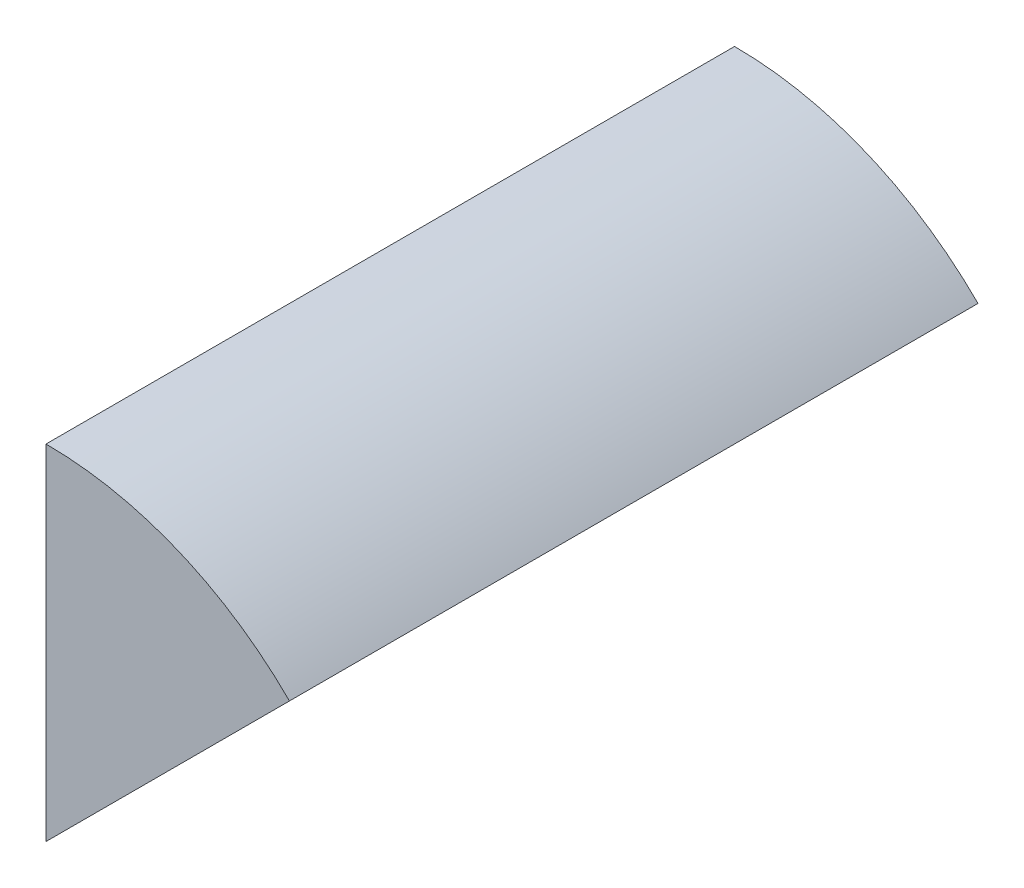
ISO-10303-21;
HEADER;
FILE_DESCRIPTION(('STEP AP214'),'2;1');
FILE_NAME('part.step','',(''),(''),'','','');
FILE_SCHEMA(('AUTOMOTIVE_DESIGN { 1 0 10303 214 1 1 1 1 }'));
ENDSEC;
DATA;
#1=APPLICATION_CONTEXT('core data for automotive mechanical design processes');
#2=APPLICATION_PROTOCOL_DEFINITION('international standard','automotive_design',2000,#1);
#3=PRODUCT_CONTEXT('',#1,'mechanical');
#4=PRODUCT('Part','Part','',(#3));
#5=PRODUCT_RELATED_PRODUCT_CATEGORY('part','',(#4));
#6=PRODUCT_DEFINITION_FORMATION('','',#4);
#7=PRODUCT_DEFINITION_CONTEXT('part definition',#1,'design');
#8=PRODUCT_DEFINITION('design','',#6,#7);
#9=PRODUCT_DEFINITION_SHAPE('','',#8);
#10=(LENGTH_UNIT() NAMED_UNIT(*) SI_UNIT(.MILLI.,.METRE.));
#11=(NAMED_UNIT(*) PLANE_ANGLE_UNIT() SI_UNIT($,.RADIAN.));
#12=(NAMED_UNIT(*) SI_UNIT($,.STERADIAN.) SOLID_ANGLE_UNIT());
#13=UNCERTAINTY_MEASURE_WITH_UNIT(LENGTH_MEASURE(1.E-05),#10,'distance_accuracy_value','');
#14=(GEOMETRIC_REPRESENTATION_CONTEXT(3) GLOBAL_UNCERTAINTY_ASSIGNED_CONTEXT((#13)) GLOBAL_UNIT_ASSIGNED_CONTEXT((#10,
#11,#12)) REPRESENTATION_CONTEXT('',''));
#15=CARTESIAN_POINT('',(0.,0.,0.));
#16=DIRECTION('',(0.,0.,1.));
#17=DIRECTION('',(1.,0.,0.));
#18=AXIS2_PLACEMENT_3D('',#15,#16,#17);
#19=CARTESIAN_POINT('',(0.,0.,50.));
#20=DIRECTION('',(-0.707106781186549,0.707106781186546,0.));
#21=DIRECTION('',(-0.707106781186546,-0.707106781186549,0.));
#22=AXIS2_PLACEMENT_3D('',#19,#20,#21);
#23=PLANE('',#22);
#24=DIRECTION('',(0.707106781186546,0.707106781186549,0.));
#25=VECTOR('',#24,1.);
#26=CARTESIAN_POINT('',(0.,0.,0.));
#27=LINE('',#26,#25);
#28=CARTESIAN_POINT('',(0.,0.,0.));
#29=VERTEX_POINT('',#28);
#30=CARTESIAN_POINT('',(17.6776695296637,17.6776695296637,0.));
#31=VERTEX_POINT('',#30);
#32=EDGE_CURVE('E80',#29,#31,#27,.T.);
#33=ORIENTED_EDGE('',*,*,#32,.T.);
#34=DIRECTION('',(0.,0.,-1.));
#35=VECTOR('',#34,1.);
#36=CARTESIAN_POINT('',(17.6776695296637,17.6776695296637,50.));
#37=LINE('',#36,#35);
#38=CARTESIAN_POINT('',(17.6776695296637,17.6776695296637,50.));
#39=VERTEX_POINT('',#38);
#40=EDGE_CURVE('E11',#39,#31,#37,.T.);
#41=ORIENTED_EDGE('',*,*,#40,.F.);
#42=DIRECTION('',(0.707106781186546,0.707106781186549,0.));
#43=VECTOR('',#42,1.);
#44=CARTESIAN_POINT('',(0.,0.,50.));
#45=LINE('',#44,#43);
#46=CARTESIAN_POINT('',(0.,0.,50.));
#47=VERTEX_POINT('',#46);
#48=EDGE_CURVE('E73',#47,#39,#45,.T.);
#49=ORIENTED_EDGE('',*,*,#48,.F.);
#50=DIRECTION('',(0.,0.,-1.));
#51=VECTOR('',#50,1.);
#52=CARTESIAN_POINT('',(0.,0.,50.));
#53=LINE('',#52,#51);
#54=EDGE_CURVE('E81',#47,#29,#53,.T.);
#55=ORIENTED_EDGE('',*,*,#54,.T.);
#56=EDGE_LOOP('',(#33,#41,#49,#55));
#57=FACE_BOUND('',#56,.T.);
#58=ADVANCED_FACE('F33',(#57),#23,.F.);
#59=CARTESIAN_POINT('',(0.,0.,50.));
#60=DIRECTION('',(0.,0.,-1.));
#61=DIRECTION('',(-1.,0.,0.));
#62=AXIS2_PLACEMENT_3D('',#59,#60,#61);
#63=CYLINDRICAL_SURFACE('',#62,25.);
#64=CARTESIAN_POINT('',(0.,0.,0.));
#65=DIRECTION('',(0.,0.,1.));
#66=DIRECTION('',(1.,0.,0.));
#67=AXIS2_PLACEMENT_3D('',#64,#65,#66);
#68=CIRCLE('',#67,25.);
#69=CARTESIAN_POINT('',(0.,25.,0.));
#70=VERTEX_POINT('',#69);
#71=EDGE_CURVE('E61',#31,#70,#68,.T.);
#72=ORIENTED_EDGE('',*,*,#71,.T.);
#73=DIRECTION('',(0.,0.,-1.));
#74=VECTOR('',#73,1.);
#75=CARTESIAN_POINT('',(0.,25.,50.));
#76=LINE('',#75,#74);
#77=CARTESIAN_POINT('',(0.,25.,50.));
#78=VERTEX_POINT('',#77);
#79=EDGE_CURVE('E41',#78,#70,#76,.T.);
#80=ORIENTED_EDGE('',*,*,#79,.F.);
#81=CARTESIAN_POINT('',(0.,0.,50.));
#82=DIRECTION('',(0.,0.,1.));
#83=DIRECTION('',(1.,0.,0.));
#84=AXIS2_PLACEMENT_3D('',#81,#82,#83);
#85=CIRCLE('',#84,25.);
#86=EDGE_CURVE('E69',#39,#78,#85,.T.);
#87=ORIENTED_EDGE('',*,*,#86,.F.);
#88=ORIENTED_EDGE('',*,*,#40,.T.);
#89=EDGE_LOOP('',(#72,#80,#87,#88));
#90=FACE_BOUND('',#89,.T.);
#91=ADVANCED_FACE('F70',(#90),#63,.T.);
#92=CARTESIAN_POINT('',(0.,25.,50.));
#93=DIRECTION('',(1.,0.,0.));
#94=DIRECTION('',(0.,0.,-1.));
#95=AXIS2_PLACEMENT_3D('',#92,#93,#94);
#96=PLANE('',#95);
#97=DIRECTION('',(0.,-1.,0.));
#98=VECTOR('',#97,1.);
#99=CARTESIAN_POINT('',(0.,25.,0.));
#100=LINE('',#99,#98);
#101=EDGE_CURVE('E66',#70,#29,#100,.T.);
#102=ORIENTED_EDGE('',*,*,#101,.T.);
#103=ORIENTED_EDGE('',*,*,#54,.F.);
#104=DIRECTION('',(0.,-1.,0.));
#105=VECTOR('',#104,1.);
#106=CARTESIAN_POINT('',(0.,25.,50.));
#107=LINE('',#106,#105);
#108=EDGE_CURVE('E49',#78,#47,#107,.T.);
#109=ORIENTED_EDGE('',*,*,#108,.F.);
#110=ORIENTED_EDGE('',*,*,#79,.T.);
#111=EDGE_LOOP('',(#102,#103,#109,#110));
#112=FACE_BOUND('',#111,.T.);
#113=ADVANCED_FACE('F92',(#112),#96,.F.);
#114=CARTESIAN_POINT('',(0.,0.,50.));
#115=DIRECTION('',(0.,0.,1.));
#116=DIRECTION('',(1.,0.,0.));
#117=AXIS2_PLACEMENT_3D('',#114,#115,#116);
#118=PLANE('',#117);
#119=ORIENTED_EDGE('',*,*,#48,.T.);
#120=ORIENTED_EDGE('',*,*,#86,.T.);
#121=ORIENTED_EDGE('',*,*,#108,.T.);
#122=EDGE_LOOP('',(#119,#120,#121));
#123=FACE_BOUND('',#122,.T.);
#124=ADVANCED_FACE('F76',(#123),#118,.T.);
#125=CARTESIAN_POINT('',(0.,0.,0.));
#126=DIRECTION('',(0.,0.,1.));
#127=DIRECTION('',(1.,0.,0.));
#128=AXIS2_PLACEMENT_3D('',#125,#126,#127);
#129=PLANE('',#128);
#130=CARTESIAN_POINT('',(6.71449158230543,16.3611231969341,0.));
#131=DIRECTION('',(0.,0.,-1.));
#132=DIRECTION('',(-1.,0.,0.));
#133=AXIS2_PLACEMENT_3D('',#130,#131,#132);
#134=CIRCLE('',#133,5.);
#135=CARTESIAN_POINT('',(1.71449158230543,16.3611231969341,0.));
#136=VERTEX_POINT('',#135);
#137=EDGE_CURVE('E87',#136,#136,#134,.T.);
#138=ORIENTED_EDGE('',*,*,#137,.F.);
#139=EDGE_LOOP('',(#138));
#140=FACE_BOUND('',#139,.T.);
#141=ORIENTED_EDGE('',*,*,#32,.F.);
#142=ORIENTED_EDGE('',*,*,#101,.F.);
#143=ORIENTED_EDGE('',*,*,#71,.F.);
#144=EDGE_LOOP('',(#141,#142,#143));
#145=FACE_BOUND('',#144,.T.);
#146=ADVANCED_FACE('F93',(#140,#145),#129,.F.);
#147=CARTESIAN_POINT('',(6.71449158230543,16.3611231969341,10.));
#148=DIRECTION('',(0.,0.,-1.));
#149=DIRECTION('',(-1.,0.,0.));
#150=AXIS2_PLACEMENT_3D('',#147,#148,#149);
#151=CYLINDRICAL_SURFACE('',#150,5.);
#152=CARTESIAN_POINT('',(6.71449158230543,16.3611231969341,10.));
#153=DIRECTION('',(0.,0.,-1.));
#154=DIRECTION('',(-1.,0.,0.));
#155=AXIS2_PLACEMENT_3D('',#152,#153,#154);
#156=CIRCLE('',#155,5.);
#157=CARTESIAN_POINT('',(1.71449158230543,16.3611231969341,10.));
#158=VERTEX_POINT('',#157);
#159=EDGE_CURVE('E83',#158,#158,#156,.T.);
#160=ORIENTED_EDGE('',*,*,#159,.F.);
#161=EDGE_LOOP('',(#160));
#162=FACE_BOUND('',#161,.T.);
#163=ORIENTED_EDGE('',*,*,#137,.T.);
#164=EDGE_LOOP('',(#163));
#165=FACE_BOUND('',#164,.T.);
#166=ADVANCED_FACE('F95',(#162,#165),#151,.F.);
#167=CARTESIAN_POINT('',(6.71449158230543,16.3611231969341,10.));
#168=DIRECTION('',(0.,0.,-1.));
#169=DIRECTION('',(-1.,0.,0.));
#170=AXIS2_PLACEMENT_3D('',#167,#168,#169);
#171=PLANE('',#170);
#172=ORIENTED_EDGE('',*,*,#159,.T.);
#173=EDGE_LOOP('',(#172));
#174=FACE_BOUND('',#173,.T.);
#175=ADVANCED_FACE('F102',(#174),#171,.T.);
#176=CLOSED_SHELL('',(#58,#91,#113,#124,#146,#166,#175));
#177=MANIFOLD_SOLID_BREP('B2',#176);
#178=ADVANCED_BREP_SHAPE_REPRESENTATION('',(#18,#177),#14);
#179=SHAPE_DEFINITION_REPRESENTATION(#9,#178);
ENDSEC;
END-ISO-10303-21;
